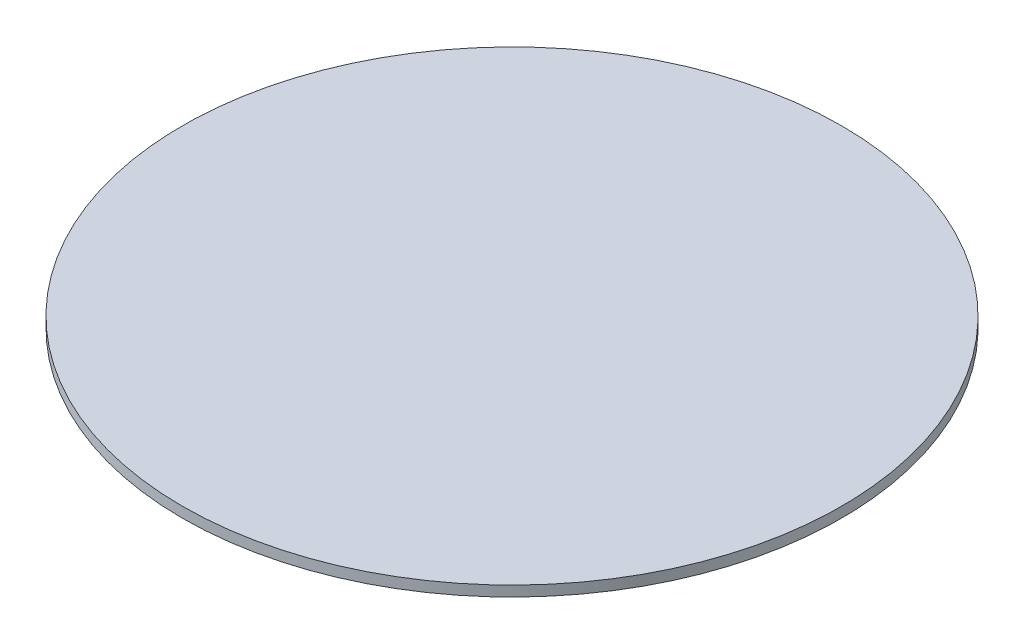
ISO-10303-21;
HEADER;
FILE_DESCRIPTION(('STEP AP214'),'2;1');
FILE_NAME('part.step','',(''),(''),'','','');
FILE_SCHEMA(('AUTOMOTIVE_DESIGN { 1 0 10303 214 1 1 1 1 }'));
ENDSEC;
DATA;
#1=APPLICATION_CONTEXT('core data for automotive mechanical design processes');
#2=APPLICATION_PROTOCOL_DEFINITION('international standard','automotive_design',2000,#1);
#3=PRODUCT_CONTEXT('',#1,'mechanical');
#4=PRODUCT('Part','Part','',(#3));
#5=PRODUCT_RELATED_PRODUCT_CATEGORY('part','',(#4));
#6=PRODUCT_DEFINITION_FORMATION('','',#4);
#7=PRODUCT_DEFINITION_CONTEXT('part definition',#1,'design');
#8=PRODUCT_DEFINITION('design','',#6,#7);
#9=PRODUCT_DEFINITION_SHAPE('','',#8);
#10=(LENGTH_UNIT() NAMED_UNIT(*) SI_UNIT(.MILLI.,.METRE.));
#11=(NAMED_UNIT(*) PLANE_ANGLE_UNIT() SI_UNIT($,.RADIAN.));
#12=(NAMED_UNIT(*) SI_UNIT($,.STERADIAN.) SOLID_ANGLE_UNIT());
#13=UNCERTAINTY_MEASURE_WITH_UNIT(LENGTH_MEASURE(1.E-05),#10,'distance_accuracy_value','');
#14=(GEOMETRIC_REPRESENTATION_CONTEXT(3) GLOBAL_UNCERTAINTY_ASSIGNED_CONTEXT((#13)) GLOBAL_UNIT_ASSIGNED_CONTEXT((#10,
#11,#12)) REPRESENTATION_CONTEXT('',''));
#15=CARTESIAN_POINT('',(0.,0.,0.));
#16=DIRECTION('',(0.,0.,1.));
#17=DIRECTION('',(1.,0.,0.));
#18=AXIS2_PLACEMENT_3D('',#15,#16,#17);
#19=CARTESIAN_POINT('',(0.,6.1,0.));
#20=DIRECTION('',(0.,-1.,0.));
#21=DIRECTION('',(0.,0.,-1.));
#22=AXIS2_PLACEMENT_3D('',#19,#20,#21);
#23=CYLINDRICAL_SURFACE('',#22,193.5);
#24=CARTESIAN_POINT('',(0.,6.1,0.));
#25=DIRECTION('',(0.,1.,0.));
#26=DIRECTION('',(0.,0.,1.));
#27=AXIS2_PLACEMENT_3D('',#24,#25,#26);
#28=CIRCLE('',#27,193.5);
#29=CARTESIAN_POINT('',(0.,6.1,193.5));
#30=VERTEX_POINT('',#29);
#31=EDGE_CURVE('E12',#30,#30,#28,.T.);
#32=ORIENTED_EDGE('',*,*,#31,.F.);
#33=EDGE_LOOP('',(#32));
#34=FACE_BOUND('',#33,.T.);
#35=CARTESIAN_POINT('',(0.,0.,0.));
#36=DIRECTION('',(0.,1.,0.));
#37=DIRECTION('',(0.,0.,1.));
#38=AXIS2_PLACEMENT_3D('',#35,#36,#37);
#39=CIRCLE('',#38,193.5);
#40=CARTESIAN_POINT('',(0.,0.,193.5));
#41=VERTEX_POINT('',#40);
#42=EDGE_CURVE('E45',#41,#41,#39,.T.);
#43=ORIENTED_EDGE('',*,*,#42,.T.);
#44=EDGE_LOOP('',(#43));
#45=FACE_BOUND('',#44,.T.);
#46=ADVANCED_FACE('F42',(#34,#45),#23,.T.);
#47=CARTESIAN_POINT('',(0.,6.1,0.));
#48=DIRECTION('',(0.,1.,0.));
#49=DIRECTION('',(0.,0.,1.));
#50=AXIS2_PLACEMENT_3D('',#47,#48,#49);
#51=PLANE('',#50);
#52=ORIENTED_EDGE('',*,*,#31,.T.);
#53=EDGE_LOOP('',(#52));
#54=FACE_BOUND('',#53,.T.);
#55=ADVANCED_FACE('F57',(#54),#51,.T.);
#56=CARTESIAN_POINT('',(0.,0.,0.));
#57=DIRECTION('',(0.,1.,0.));
#58=DIRECTION('',(0.,0.,1.));
#59=AXIS2_PLACEMENT_3D('',#56,#57,#58);
#60=PLANE('',#59);
#61=ORIENTED_EDGE('',*,*,#42,.F.);
#62=EDGE_LOOP('',(#61));
#63=FACE_BOUND('',#62,.T.);
#64=ADVANCED_FACE('F55',(#63),#60,.F.);
#65=CLOSED_SHELL('',(#46,#55,#64));
#66=MANIFOLD_SOLID_BREP('B2',#65);
#67=ADVANCED_BREP_SHAPE_REPRESENTATION('',(#18,#66),#14);
#68=SHAPE_DEFINITION_REPRESENTATION(#9,#67);
ENDSEC;
END-ISO-10303-21;
